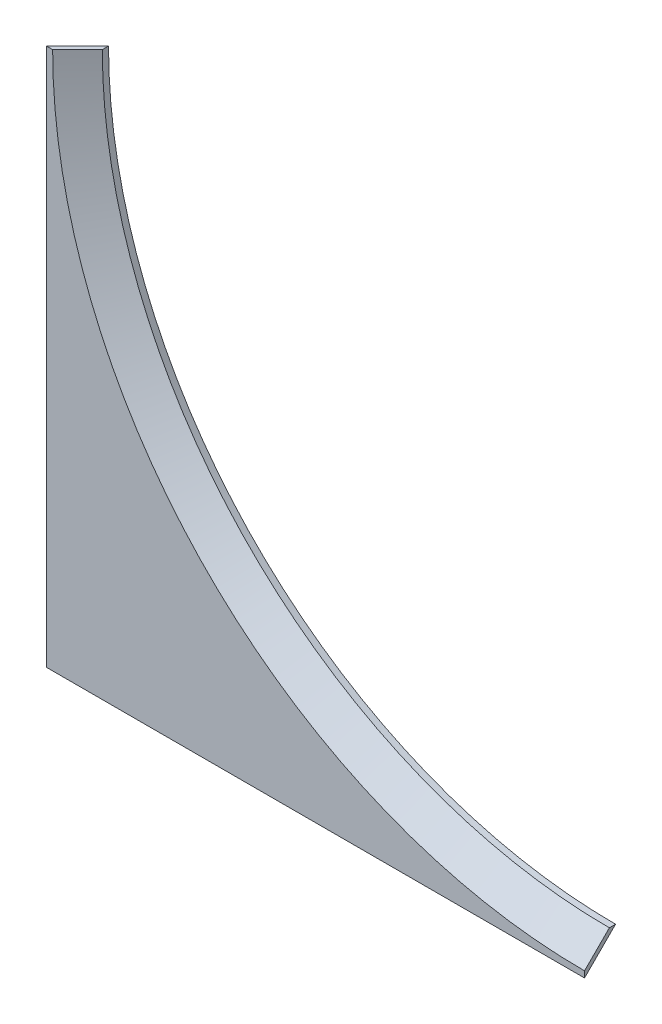
ISO-10303-21;
HEADER;
FILE_DESCRIPTION(('STEP AP214'),'2;1');
FILE_NAME('part.step','',(''),(''),'','','');
FILE_SCHEMA(('AUTOMOTIVE_DESIGN { 1 0 10303 214 1 1 1 1 }'));
ENDSEC;
DATA;
#1=APPLICATION_CONTEXT('core data for automotive mechanical design processes');
#2=APPLICATION_PROTOCOL_DEFINITION('international standard','automotive_design',2000,#1);
#3=PRODUCT_CONTEXT('',#1,'mechanical');
#4=PRODUCT('Part','Part','',(#3));
#5=PRODUCT_RELATED_PRODUCT_CATEGORY('part','',(#4));
#6=PRODUCT_DEFINITION_FORMATION('','',#4);
#7=PRODUCT_DEFINITION_CONTEXT('part definition',#1,'design');
#8=PRODUCT_DEFINITION('design','',#6,#7);
#9=PRODUCT_DEFINITION_SHAPE('','',#8);
#10=(LENGTH_UNIT() NAMED_UNIT(*) SI_UNIT(.MILLI.,.METRE.));
#11=(NAMED_UNIT(*) PLANE_ANGLE_UNIT() SI_UNIT($,.RADIAN.));
#12=(NAMED_UNIT(*) SI_UNIT($,.STERADIAN.) SOLID_ANGLE_UNIT());
#13=UNCERTAINTY_MEASURE_WITH_UNIT(LENGTH_MEASURE(1.E-05),#10,'distance_accuracy_value','');
#14=(GEOMETRIC_REPRESENTATION_CONTEXT(3) GLOBAL_UNCERTAINTY_ASSIGNED_CONTEXT((#13)) GLOBAL_UNIT_ASSIGNED_CONTEXT((#10,
#11,#12)) REPRESENTATION_CONTEXT('',''));
#15=CARTESIAN_POINT('',(0.,0.,0.));
#16=DIRECTION('',(0.,0.,1.));
#17=DIRECTION('',(1.,0.,0.));
#18=AXIS2_PLACEMENT_3D('',#15,#16,#17);
#19=CARTESIAN_POINT('',(260.,260.,15.));
#20=DIRECTION('',(0.,0.,-1.));
#21=DIRECTION('',(-1.,0.,0.));
#22=AXIS2_PLACEMENT_3D('',#19,#20,#21);
#23=CYLINDRICAL_SURFACE('',#22,245.);
#24=DIRECTION('',(0.,0.,-1.));
#25=VECTOR('',#24,1.);
#26=CARTESIAN_POINT('',(15.,260.,15.));
#27=LINE('',#26,#25);
#28=CARTESIAN_POINT('',(15.,260.,2.99999999999999));
#29=VERTEX_POINT('',#28);
#30=CARTESIAN_POINT('',(15.,260.,0.));
#31=VERTEX_POINT('',#30);
#32=EDGE_CURVE('E131',#29,#31,#27,.T.);
#33=ORIENTED_EDGE('',*,*,#32,.F.);
#34=CARTESIAN_POINT('',(260.,260.,2.99999999999999));
#35=DIRECTION('',(0.,0.,1.));
#36=DIRECTION('',(1.,0.,0.));
#37=AXIS2_PLACEMENT_3D('',#34,#35,#36);
#38=CIRCLE('',#37,245.);
#39=CARTESIAN_POINT('',(260.,15.0000000000001,2.99999999999999));
#40=VERTEX_POINT('',#39);
#41=EDGE_CURVE('E57',#29,#40,#38,.T.);
#42=ORIENTED_EDGE('',*,*,#41,.T.);
#43=DIRECTION('',(0.,0.,-1.));
#44=VECTOR('',#43,1.);
#45=CARTESIAN_POINT('',(260.,15.0000000000001,15.));
#46=LINE('',#45,#44);
#47=CARTESIAN_POINT('',(260.,15.0000000000001,0.));
#48=VERTEX_POINT('',#47);
#49=EDGE_CURVE('E134',#40,#48,#46,.T.);
#50=ORIENTED_EDGE('',*,*,#49,.T.);
#51=CARTESIAN_POINT('',(260.,260.,0.));
#52=DIRECTION('',(0.,0.,-1.));
#53=DIRECTION('',(1.,0.,0.));
#54=AXIS2_PLACEMENT_3D('',#51,#52,#53);
#55=CIRCLE('',#54,245.);
#56=EDGE_CURVE('E115',#48,#31,#55,.T.);
#57=ORIENTED_EDGE('',*,*,#56,.T.);
#58=EDGE_LOOP('',(#33,#42,#50,#57));
#59=FACE_BOUND('',#58,.T.);
#60=ADVANCED_FACE('F47',(#59),#23,.F.);
#61=CARTESIAN_POINT('',(260.,260.,15.));
#62=DIRECTION('',(0.,0.,1.));
#63=DIRECTION('',(1.,0.,0.));
#64=AXIS2_PLACEMENT_3D('',#61,#62,#63);
#65=PLANE('',#64);
#66=DIRECTION('',(0.,-1.,0.));
#67=VECTOR('',#66,1.);
#68=CARTESIAN_POINT('',(260.,0.,15.));
#69=LINE('',#68,#67);
#70=CARTESIAN_POINT('',(260.,3.00000000000006,15.));
#71=VERTEX_POINT('',#70);
#72=CARTESIAN_POINT('',(260.,0.,15.));
#73=VERTEX_POINT('',#72);
#74=EDGE_CURVE('E106',#71,#73,#69,.T.);
#75=ORIENTED_EDGE('',*,*,#74,.F.);
#76=CARTESIAN_POINT('',(260.,260.,15.));
#77=DIRECTION('',(0.,0.,1.));
#78=DIRECTION('',(1.,0.,0.));
#79=AXIS2_PLACEMENT_3D('',#76,#77,#78);
#80=CIRCLE('',#79,257.);
#81=CARTESIAN_POINT('',(3.00000000000006,260.,15.));
#82=VERTEX_POINT('',#81);
#83=EDGE_CURVE('E137',#71,#82,#80,.F.);
#84=ORIENTED_EDGE('',*,*,#83,.T.);
#85=DIRECTION('',(-1.,0.,0.));
#86=VECTOR('',#85,1.);
#87=CARTESIAN_POINT('',(0.,260.,15.));
#88=LINE('',#87,#86);
#89=CARTESIAN_POINT('',(0.,260.,15.));
#90=VERTEX_POINT('',#89);
#91=EDGE_CURVE('E147',#82,#90,#88,.T.);
#92=ORIENTED_EDGE('',*,*,#91,.T.);
#93=DIRECTION('',(0.,-1.,0.));
#94=VECTOR('',#93,1.);
#95=CARTESIAN_POINT('',(0.,260.,15.));
#96=LINE('',#95,#94);
#97=CARTESIAN_POINT('',(0.,-1.04083408558608E-13,15.));
#98=VERTEX_POINT('',#97);
#99=EDGE_CURVE('E123',#90,#98,#96,.T.);
#100=ORIENTED_EDGE('',*,*,#99,.T.);
#101=DIRECTION('',(-1.,0.,0.));
#102=VECTOR('',#101,1.);
#103=CARTESIAN_POINT('',(260.,0.,15.));
#104=LINE('',#103,#102);
#105=EDGE_CURVE('E101',#73,#98,#104,.T.);
#106=ORIENTED_EDGE('',*,*,#105,.F.);
#107=EDGE_LOOP('',(#75,#84,#92,#100,#106));
#108=FACE_BOUND('',#107,.T.);
#109=ADVANCED_FACE('F146',(#108),#65,.T.);
#110=CARTESIAN_POINT('',(260.,260.,0.));
#111=DIRECTION('',(0.,0.,1.));
#112=DIRECTION('',(1.,0.,0.));
#113=AXIS2_PLACEMENT_3D('',#110,#111,#112);
#114=PLANE('',#113);
#115=DIRECTION('',(0.,-1.,0.));
#116=VECTOR('',#115,1.);
#117=CARTESIAN_POINT('',(15.0000000000001,15.0000000000001,0.));
#118=LINE('',#117,#116);
#119=CARTESIAN_POINT('',(15.0000000000001,15.0000000000001,0.));
#120=VERTEX_POINT('',#119);
#121=EDGE_CURVE('E112',#31,#120,#118,.T.);
#122=ORIENTED_EDGE('',*,*,#121,.F.);
#123=ORIENTED_EDGE('',*,*,#56,.F.);
#124=DIRECTION('',(1.,0.,0.));
#125=VECTOR('',#124,1.);
#126=CARTESIAN_POINT('',(15.0000000000001,15.0000000000001,0.));
#127=LINE('',#126,#125);
#128=EDGE_CURVE('E99',#120,#48,#127,.T.);
#129=ORIENTED_EDGE('',*,*,#128,.F.);
#130=EDGE_LOOP('',(#122,#123,#129));
#131=FACE_BOUND('',#130,.T.);
#132=ADVANCED_FACE('F111',(#131),#114,.F.);
#133=CARTESIAN_POINT('',(15.0000000000001,260.,0.));
#134=DIRECTION('',(-0.707106781186546,0.,-0.707106781186549));
#135=DIRECTION('',(-0.707106781186549,0.,0.707106781186546));
#136=AXIS2_PLACEMENT_3D('',#133,#134,#135);
#137=PLANE('',#136);
#138=ORIENTED_EDGE('',*,*,#121,.T.);
#139=DIRECTION('',(0.577350269189627,0.577350269189627,-0.577350269189624));
#140=VECTOR('',#139,1.);
#141=CARTESIAN_POINT('',(96.6666666666669,96.6666666666669,-81.6666666666666));
#142=LINE('',#141,#140);
#143=EDGE_CURVE('E95',#98,#120,#142,.T.);
#144=ORIENTED_EDGE('',*,*,#143,.F.);
#145=ORIENTED_EDGE('',*,*,#99,.F.);
#146=DIRECTION('',(0.707106781186549,0.,-0.707106781186546));
#147=VECTOR('',#146,1.);
#148=CARTESIAN_POINT('',(15.0000000000001,260.,0.));
#149=LINE('',#148,#147);
#150=EDGE_CURVE('E121',#90,#31,#149,.T.);
#151=ORIENTED_EDGE('',*,*,#150,.T.);
#152=EDGE_LOOP('',(#138,#144,#145,#151));
#153=FACE_BOUND('',#152,.T.);
#154=ADVANCED_FACE('F119',(#153),#137,.T.);
#155=CARTESIAN_POINT('',(0.,260.,0.));
#156=DIRECTION('',(0.,-1.,0.));
#157=DIRECTION('',(0.,0.,-1.));
#158=AXIS2_PLACEMENT_3D('',#155,#156,#157);
#159=PLANE('',#158);
#160=ORIENTED_EDGE('',*,*,#91,.F.);
#161=DIRECTION('',(0.707106781186547,0.,-0.707106781186548));
#162=VECTOR('',#161,1.);
#163=CARTESIAN_POINT('',(260.,260.,-242.000000000001));
#164=LINE('',#163,#162);
#165=EDGE_CURVE('E71',#82,#29,#164,.T.);
#166=ORIENTED_EDGE('',*,*,#165,.T.);
#167=ORIENTED_EDGE('',*,*,#32,.T.);
#168=ORIENTED_EDGE('',*,*,#150,.F.);
#169=EDGE_LOOP('',(#160,#166,#167,#168));
#170=FACE_BOUND('',#169,.T.);
#171=ADVANCED_FACE('F150',(#170),#159,.F.);
#172=CARTESIAN_POINT('',(260.,15.0000000000001,0.));
#173=DIRECTION('',(0.,0.707106781186546,0.707106781186549));
#174=DIRECTION('',(0.,-0.707106781186549,0.707106781186546));
#175=AXIS2_PLACEMENT_3D('',#172,#173,#174);
#176=PLANE('',#175);
#177=ORIENTED_EDGE('',*,*,#105,.T.);
#178=ORIENTED_EDGE('',*,*,#143,.T.);
#179=ORIENTED_EDGE('',*,*,#128,.T.);
#180=DIRECTION('',(0.,0.707106781186549,-0.707106781186546));
#181=VECTOR('',#180,1.);
#182=CARTESIAN_POINT('',(260.,15.0000000000001,0.));
#183=LINE('',#182,#181);
#184=EDGE_CURVE('E155',#73,#48,#183,.T.);
#185=ORIENTED_EDGE('',*,*,#184,.F.);
#186=EDGE_LOOP('',(#177,#178,#179,#185));
#187=FACE_BOUND('',#186,.T.);
#188=ADVANCED_FACE('F97',(#187),#176,.F.);
#189=CARTESIAN_POINT('',(260.,0.,0.));
#190=DIRECTION('',(1.,0.,0.));
#191=DIRECTION('',(0.,0.,-1.));
#192=AXIS2_PLACEMENT_3D('',#189,#190,#191);
#193=PLANE('',#192);
#194=ORIENTED_EDGE('',*,*,#49,.F.);
#195=DIRECTION('',(0.,0.707106781186547,-0.707106781186548));
#196=VECTOR('',#195,1.);
#197=CARTESIAN_POINT('',(260.,260.,-242.000000000001));
#198=LINE('',#197,#196);
#199=EDGE_CURVE('E11',#40,#71,#198,.F.);
#200=ORIENTED_EDGE('',*,*,#199,.T.);
#201=ORIENTED_EDGE('',*,*,#74,.T.);
#202=ORIENTED_EDGE('',*,*,#184,.T.);
#203=EDGE_LOOP('',(#194,#200,#201,#202));
#204=FACE_BOUND('',#203,.T.);
#205=ADVANCED_FACE('F162',(#204),#193,.T.);
#206=CARTESIAN_POINT('',(260.,260.,15.));
#207=DIRECTION('',(0.,0.,1.));
#208=DIRECTION('',(1.,0.,0.));
#209=AXIS2_PLACEMENT_3D('',#206,#207,#208);
#210=CONICAL_SURFACE('',#209,257.,0.785398163397447);
#211=ORIENTED_EDGE('',*,*,#199,.F.);
#212=ORIENTED_EDGE('',*,*,#41,.F.);
#213=ORIENTED_EDGE('',*,*,#165,.F.);
#214=ORIENTED_EDGE('',*,*,#83,.F.);
#215=EDGE_LOOP('',(#211,#212,#213,#214));
#216=FACE_BOUND('',#215,.T.);
#217=ADVANCED_FACE('F50',(#216),#210,.F.);
#218=CLOSED_SHELL('',(#60,#109,#132,#154,#171,#188,#205,#217));
#219=MANIFOLD_SOLID_BREP('B2',#218);
#220=ADVANCED_BREP_SHAPE_REPRESENTATION('',(#18,#219),#14);
#221=SHAPE_DEFINITION_REPRESENTATION(#9,#220);
ENDSEC;
END-ISO-10303-21;
